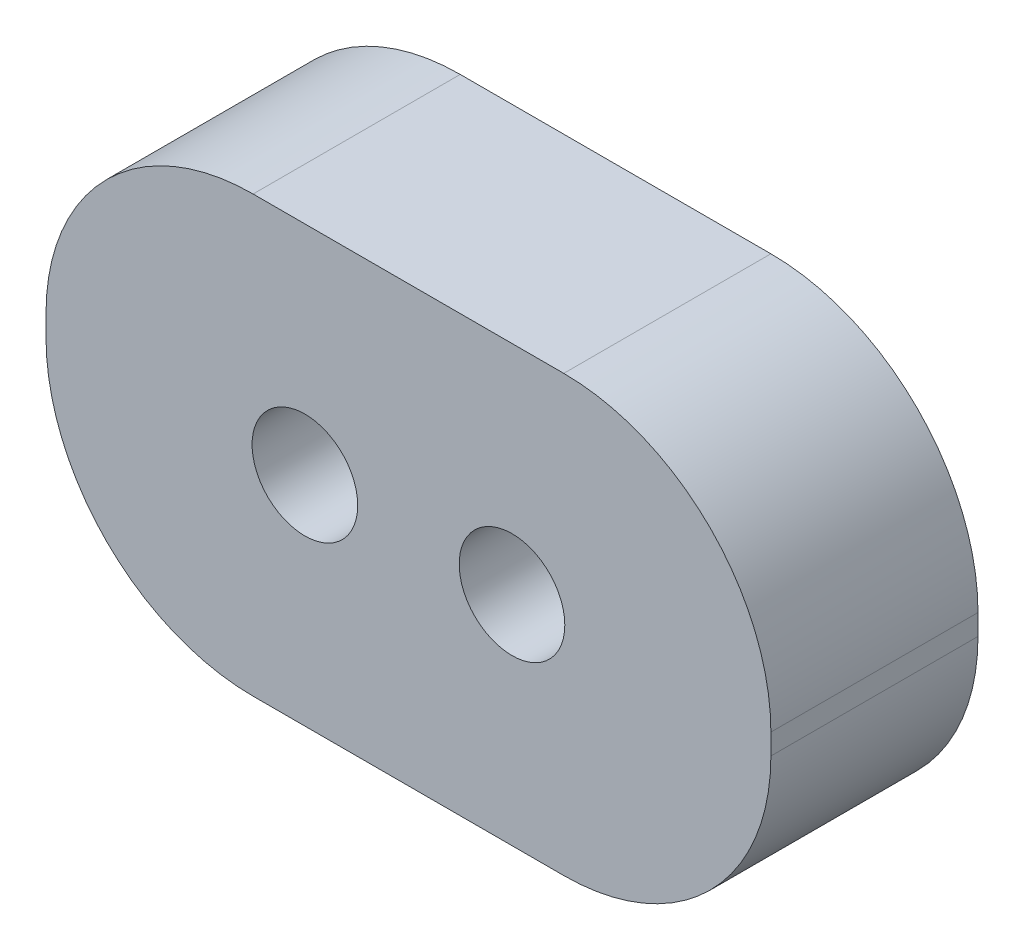
ISO-10303-21;
HEADER;
FILE_DESCRIPTION(('STEP AP214'),'2;1');
FILE_NAME('part.step','',(''),(''),'','','');
FILE_SCHEMA(('AUTOMOTIVE_DESIGN { 1 0 10303 214 1 1 1 1 }'));
ENDSEC;
DATA;
#1=APPLICATION_CONTEXT('core data for automotive mechanical design processes');
#2=APPLICATION_PROTOCOL_DEFINITION('international standard','automotive_design',2000,#1);
#3=PRODUCT_CONTEXT('',#1,'mechanical');
#4=PRODUCT('Part','Part','',(#3));
#5=PRODUCT_RELATED_PRODUCT_CATEGORY('part','',(#4));
#6=PRODUCT_DEFINITION_FORMATION('','',#4);
#7=PRODUCT_DEFINITION_CONTEXT('part definition',#1,'design');
#8=PRODUCT_DEFINITION('design','',#6,#7);
#9=PRODUCT_DEFINITION_SHAPE('','',#8);
#10=(LENGTH_UNIT() NAMED_UNIT(*) SI_UNIT(.MILLI.,.METRE.));
#11=(NAMED_UNIT(*) PLANE_ANGLE_UNIT() SI_UNIT($,.RADIAN.));
#12=(NAMED_UNIT(*) SI_UNIT($,.STERADIAN.) SOLID_ANGLE_UNIT());
#13=UNCERTAINTY_MEASURE_WITH_UNIT(LENGTH_MEASURE(1.E-05),#10,'distance_accuracy_value','');
#14=(GEOMETRIC_REPRESENTATION_CONTEXT(3) GLOBAL_UNCERTAINTY_ASSIGNED_CONTEXT((#13)) GLOBAL_UNIT_ASSIGNED_CONTEXT((#10,
#11,#12)) REPRESENTATION_CONTEXT('',''));
#15=CARTESIAN_POINT('',(0.,0.,0.));
#16=DIRECTION('',(0.,0.,1.));
#17=DIRECTION('',(1.,0.,0.));
#18=AXIS2_PLACEMENT_3D('',#15,#16,#17);
#19=CARTESIAN_POINT('',(-158.522817540017,297.237393461444,10.));
#20=DIRECTION('',(0.,0.,1.));
#21=DIRECTION('',(1.,0.,0.));
#22=AXIS2_PLACEMENT_3D('',#19,#20,#21);
#23=PLANE('',#22);
#24=CARTESIAN_POINT('',(-171.022817540019,296.73739346264,10.));
#25=DIRECTION('',(0.,0.,1.));
#26=DIRECTION('',(1.,0.,0.));
#27=AXIS2_PLACEMENT_3D('',#24,#25,#26);
#28=CIRCLE('',#27,2.55);
#29=CARTESIAN_POINT('',(-168.472817540019,296.73739346264,10.));
#30=VERTEX_POINT('',#29);
#31=EDGE_CURVE('E135',#30,#30,#28,.T.);
#32=ORIENTED_EDGE('',*,*,#31,.F.);
#33=EDGE_LOOP('',(#32));
#34=FACE_BOUND('',#33,.T.);
#35=CARTESIAN_POINT('',(-158.522817540017,297.237393461444,10.));
#36=DIRECTION('',(0.,0.,1.));
#37=DIRECTION('',(1.,0.,0.));
#38=AXIS2_PLACEMENT_3D('',#35,#36,#37);
#39=CIRCLE('',#38,9.99999999999902);
#40=CARTESIAN_POINT('',(-148.522817540018,297.237393461444,10.));
#41=VERTEX_POINT('',#40);
#42=CARTESIAN_POINT('',(-158.522817540018,307.237393461443,10.));
#43=VERTEX_POINT('',#42);
#44=EDGE_CURVE('E146',#41,#43,#39,.T.);
#45=ORIENTED_EDGE('',*,*,#44,.T.);
#46=DIRECTION('',(-1.,0.,0.));
#47=VECTOR('',#46,1.);
#48=CARTESIAN_POINT('',(-158.522817540018,307.237393461443,10.));
#49=LINE('',#48,#47);
#50=CARTESIAN_POINT('',(-173.522817540019,307.237393461443,10.));
#51=VERTEX_POINT('',#50);
#52=EDGE_CURVE('E94',#43,#51,#49,.T.);
#53=ORIENTED_EDGE('',*,*,#52,.T.);
#54=CARTESIAN_POINT('',(-173.52281754002,297.237393461444,10.));
#55=DIRECTION('',(0.,0.,1.));
#56=DIRECTION('',(1.,0.,0.));
#57=AXIS2_PLACEMENT_3D('',#54,#55,#56);
#58=CIRCLE('',#57,9.99999999999902);
#59=CARTESIAN_POINT('',(-183.522817540019,297.237393461444,10.));
#60=VERTEX_POINT('',#59);
#61=EDGE_CURVE('E161',#51,#60,#58,.T.);
#62=ORIENTED_EDGE('',*,*,#61,.T.);
#63=DIRECTION('',(0.,-1.,0.));
#64=VECTOR('',#63,1.);
#65=CARTESIAN_POINT('',(-183.522817540019,297.237393461444,10.));
#66=LINE('',#65,#64);
#67=CARTESIAN_POINT('',(-183.522817540019,296.237393463835,10.));
#68=VERTEX_POINT('',#67);
#69=EDGE_CURVE('E174',#60,#68,#66,.T.);
#70=ORIENTED_EDGE('',*,*,#69,.T.);
#71=CARTESIAN_POINT('',(-173.52281754002,296.237393463835,10.));
#72=DIRECTION('',(0.,0.,1.));
#73=DIRECTION('',(-1.,0.,0.));
#74=AXIS2_PLACEMENT_3D('',#71,#72,#73);
#75=CIRCLE('',#74,9.99999999999902);
#76=CARTESIAN_POINT('',(-173.522817540019,286.237393463836,10.));
#77=VERTEX_POINT('',#76);
#78=EDGE_CURVE('E113',#68,#77,#75,.T.);
#79=ORIENTED_EDGE('',*,*,#78,.T.);
#80=DIRECTION('',(1.,0.,0.));
#81=VECTOR('',#80,1.);
#82=CARTESIAN_POINT('',(-158.522817540018,286.237393463836,10.));
#83=LINE('',#82,#81);
#84=CARTESIAN_POINT('',(-158.522817540018,286.237393463836,10.));
#85=VERTEX_POINT('',#84);
#86=EDGE_CURVE('E107',#77,#85,#83,.T.);
#87=ORIENTED_EDGE('',*,*,#86,.T.);
#88=CARTESIAN_POINT('',(-158.522817540017,296.237393463835,10.));
#89=DIRECTION('',(0.,0.,1.));
#90=DIRECTION('',(-1.,0.,0.));
#91=AXIS2_PLACEMENT_3D('',#88,#89,#90);
#92=CIRCLE('',#91,9.99999999999902);
#93=CARTESIAN_POINT('',(-148.522817540018,296.237393463835,10.));
#94=VERTEX_POINT('',#93);
#95=EDGE_CURVE('E111',#85,#94,#92,.T.);
#96=ORIENTED_EDGE('',*,*,#95,.T.);
#97=DIRECTION('',(0.,1.,0.));
#98=VECTOR('',#97,1.);
#99=CARTESIAN_POINT('',(-148.522817540018,296.237393463835,10.));
#100=LINE('',#99,#98);
#101=EDGE_CURVE('E51',#94,#41,#100,.T.);
#102=ORIENTED_EDGE('',*,*,#101,.T.);
#103=EDGE_LOOP('',(#45,#53,#62,#70,#79,#87,#96,#102));
#104=FACE_BOUND('',#103,.T.);
#105=CARTESIAN_POINT('',(-161.022817540019,296.73739346264,10.));
#106=DIRECTION('',(0.,0.,1.));
#107=DIRECTION('',(1.,0.,0.));
#108=AXIS2_PLACEMENT_3D('',#105,#106,#107);
#109=CIRCLE('',#108,2.55);
#110=CARTESIAN_POINT('',(-158.472817540019,296.73739346264,10.));
#111=VERTEX_POINT('',#110);
#112=EDGE_CURVE('E183',#111,#111,#109,.T.);
#113=ORIENTED_EDGE('',*,*,#112,.F.);
#114=EDGE_LOOP('',(#113));
#115=FACE_BOUND('',#114,.T.);
#116=ADVANCED_FACE('F34',(#34,#104,#115),#23,.T.);
#117=CARTESIAN_POINT('',(-158.522817540017,297.237393461444,0.));
#118=DIRECTION('',(0.,0.,1.));
#119=DIRECTION('',(1.,0.,0.));
#120=AXIS2_PLACEMENT_3D('',#117,#118,#119);
#121=PLANE('',#120);
#122=CARTESIAN_POINT('',(-171.022817540019,296.73739346264,0.));
#123=DIRECTION('',(0.,0.,1.));
#124=DIRECTION('',(1.,0.,0.));
#125=AXIS2_PLACEMENT_3D('',#122,#123,#124);
#126=CIRCLE('',#125,2.55);
#127=CARTESIAN_POINT('',(-168.472817540019,296.73739346264,0.));
#128=VERTEX_POINT('',#127);
#129=EDGE_CURVE('E180',#128,#128,#126,.T.);
#130=ORIENTED_EDGE('',*,*,#129,.T.);
#131=EDGE_LOOP('',(#130));
#132=FACE_BOUND('',#131,.T.);
#133=CARTESIAN_POINT('',(-158.522817540017,297.237393461444,0.));
#134=DIRECTION('',(0.,0.,1.));
#135=DIRECTION('',(1.,0.,0.));
#136=AXIS2_PLACEMENT_3D('',#133,#134,#135);
#137=CIRCLE('',#136,9.99999999999902);
#138=CARTESIAN_POINT('',(-148.522817540018,297.237393461444,0.));
#139=VERTEX_POINT('',#138);
#140=CARTESIAN_POINT('',(-158.522817540018,307.237393461443,0.));
#141=VERTEX_POINT('',#140);
#142=EDGE_CURVE('E131',#139,#141,#137,.T.);
#143=ORIENTED_EDGE('',*,*,#142,.F.);
#144=DIRECTION('',(0.,1.,0.));
#145=VECTOR('',#144,1.);
#146=CARTESIAN_POINT('',(-148.522817540018,296.237393463835,0.));
#147=LINE('',#146,#145);
#148=CARTESIAN_POINT('',(-148.522817540018,296.237393463835,0.));
#149=VERTEX_POINT('',#148);
#150=EDGE_CURVE('E86',#149,#139,#147,.T.);
#151=ORIENTED_EDGE('',*,*,#150,.F.);
#152=CARTESIAN_POINT('',(-158.522817540017,296.237393463835,0.));
#153=DIRECTION('',(0.,0.,1.));
#154=DIRECTION('',(-1.,0.,0.));
#155=AXIS2_PLACEMENT_3D('',#152,#153,#154);
#156=CIRCLE('',#155,9.99999999999902);
#157=CARTESIAN_POINT('',(-158.522817540018,286.237393463836,0.));
#158=VERTEX_POINT('',#157);
#159=EDGE_CURVE('E80',#158,#149,#156,.T.);
#160=ORIENTED_EDGE('',*,*,#159,.F.);
#161=DIRECTION('',(1.,0.,0.));
#162=VECTOR('',#161,1.);
#163=CARTESIAN_POINT('',(-158.522817540018,286.237393463836,0.));
#164=LINE('',#163,#162);
#165=CARTESIAN_POINT('',(-173.522817540019,286.237393463836,0.));
#166=VERTEX_POINT('',#165);
#167=EDGE_CURVE('E121',#166,#158,#164,.T.);
#168=ORIENTED_EDGE('',*,*,#167,.F.);
#169=CARTESIAN_POINT('',(-173.52281754002,296.237393463835,0.));
#170=DIRECTION('',(0.,0.,1.));
#171=DIRECTION('',(-1.,0.,0.));
#172=AXIS2_PLACEMENT_3D('',#169,#170,#171);
#173=CIRCLE('',#172,9.99999999999902);
#174=CARTESIAN_POINT('',(-183.522817540019,296.237393463835,0.));
#175=VERTEX_POINT('',#174);
#176=EDGE_CURVE('E141',#175,#166,#173,.T.);
#177=ORIENTED_EDGE('',*,*,#176,.F.);
#178=DIRECTION('',(0.,-1.,0.));
#179=VECTOR('',#178,1.);
#180=CARTESIAN_POINT('',(-183.522817540019,297.237393461444,0.));
#181=LINE('',#180,#179);
#182=CARTESIAN_POINT('',(-183.522817540019,297.237393461444,0.));
#183=VERTEX_POINT('',#182);
#184=EDGE_CURVE('E139',#183,#175,#181,.T.);
#185=ORIENTED_EDGE('',*,*,#184,.F.);
#186=CARTESIAN_POINT('',(-173.52281754002,297.237393461444,0.));
#187=DIRECTION('',(0.,0.,1.));
#188=DIRECTION('',(1.,0.,0.));
#189=AXIS2_PLACEMENT_3D('',#186,#187,#188);
#190=CIRCLE('',#189,9.99999999999902);
#191=CARTESIAN_POINT('',(-173.522817540019,307.237393461443,0.));
#192=VERTEX_POINT('',#191);
#193=EDGE_CURVE('E137',#192,#183,#190,.T.);
#194=ORIENTED_EDGE('',*,*,#193,.F.);
#195=DIRECTION('',(-1.,0.,0.));
#196=VECTOR('',#195,1.);
#197=CARTESIAN_POINT('',(-158.522817540018,307.237393461443,0.));
#198=LINE('',#197,#196);
#199=EDGE_CURVE('E134',#141,#192,#198,.T.);
#200=ORIENTED_EDGE('',*,*,#199,.F.);
#201=EDGE_LOOP('',(#143,#151,#160,#168,#177,#185,#194,#200));
#202=FACE_BOUND('',#201,.T.);
#203=CARTESIAN_POINT('',(-161.022817540019,296.73739346264,0.));
#204=DIRECTION('',(0.,0.,1.));
#205=DIRECTION('',(1.,0.,0.));
#206=AXIS2_PLACEMENT_3D('',#203,#204,#205);
#207=CIRCLE('',#206,2.55);
#208=CARTESIAN_POINT('',(-158.472817540019,296.73739346264,0.));
#209=VERTEX_POINT('',#208);
#210=EDGE_CURVE('E186',#209,#209,#207,.T.);
#211=ORIENTED_EDGE('',*,*,#210,.T.);
#212=EDGE_LOOP('',(#211));
#213=FACE_BOUND('',#212,.T.);
#214=ADVANCED_FACE('F165',(#132,#202,#213),#121,.F.);
#215=CARTESIAN_POINT('',(-158.522817540017,297.237393461444,10.));
#216=DIRECTION('',(0.,0.,-1.));
#217=DIRECTION('',(-1.,0.,0.));
#218=AXIS2_PLACEMENT_3D('',#215,#216,#217);
#219=CYLINDRICAL_SURFACE('',#218,9.99999999999902);
#220=ORIENTED_EDGE('',*,*,#142,.T.);
#221=DIRECTION('',(0.,0.,-1.));
#222=VECTOR('',#221,1.);
#223=CARTESIAN_POINT('',(-158.522817540018,307.237393461443,10.));
#224=LINE('',#223,#222);
#225=EDGE_CURVE('E11',#43,#141,#224,.T.);
#226=ORIENTED_EDGE('',*,*,#225,.F.);
#227=ORIENTED_EDGE('',*,*,#44,.F.);
#228=DIRECTION('',(0.,0.,-1.));
#229=VECTOR('',#228,1.);
#230=CARTESIAN_POINT('',(-148.522817540018,297.237393461444,10.));
#231=LINE('',#230,#229);
#232=EDGE_CURVE('E127',#41,#139,#231,.T.);
#233=ORIENTED_EDGE('',*,*,#232,.T.);
#234=EDGE_LOOP('',(#220,#226,#227,#233));
#235=FACE_BOUND('',#234,.T.);
#236=ADVANCED_FACE('F36',(#235),#219,.T.);
#237=CARTESIAN_POINT('',(-158.522817540018,307.237393461443,10.));
#238=DIRECTION('',(0.,-1.,0.));
#239=DIRECTION('',(0.,0.,-1.));
#240=AXIS2_PLACEMENT_3D('',#237,#238,#239);
#241=PLANE('',#240);
#242=ORIENTED_EDGE('',*,*,#199,.T.);
#243=DIRECTION('',(0.,0.,-1.));
#244=VECTOR('',#243,1.);
#245=CARTESIAN_POINT('',(-173.522817540019,307.237393461443,10.));
#246=LINE('',#245,#244);
#247=EDGE_CURVE('E43',#51,#192,#246,.T.);
#248=ORIENTED_EDGE('',*,*,#247,.F.);
#249=ORIENTED_EDGE('',*,*,#52,.F.);
#250=ORIENTED_EDGE('',*,*,#225,.T.);
#251=EDGE_LOOP('',(#242,#248,#249,#250));
#252=FACE_BOUND('',#251,.T.);
#253=ADVANCED_FACE('F219',(#252),#241,.F.);
#254=CARTESIAN_POINT('',(-173.52281754002,297.237393461444,10.));
#255=DIRECTION('',(0.,0.,-1.));
#256=DIRECTION('',(-1.,0.,0.));
#257=AXIS2_PLACEMENT_3D('',#254,#255,#256);
#258=CYLINDRICAL_SURFACE('',#257,9.99999999999902);
#259=ORIENTED_EDGE('',*,*,#193,.T.);
#260=DIRECTION('',(0.,0.,-1.));
#261=VECTOR('',#260,1.);
#262=CARTESIAN_POINT('',(-183.522817540019,297.237393461444,10.));
#263=LINE('',#262,#261);
#264=EDGE_CURVE('E153',#60,#183,#263,.T.);
#265=ORIENTED_EDGE('',*,*,#264,.F.);
#266=ORIENTED_EDGE('',*,*,#61,.F.);
#267=ORIENTED_EDGE('',*,*,#247,.T.);
#268=EDGE_LOOP('',(#259,#265,#266,#267));
#269=FACE_BOUND('',#268,.T.);
#270=ADVANCED_FACE('F159',(#269),#258,.T.);
#271=CARTESIAN_POINT('',(-183.522817540019,297.237393461444,10.));
#272=DIRECTION('',(1.,0.,0.));
#273=DIRECTION('',(0.,0.,-1.));
#274=AXIS2_PLACEMENT_3D('',#271,#272,#273);
#275=PLANE('',#274);
#276=ORIENTED_EDGE('',*,*,#184,.T.);
#277=DIRECTION('',(0.,0.,-1.));
#278=VECTOR('',#277,1.);
#279=CARTESIAN_POINT('',(-183.522817540019,296.237393463835,10.));
#280=LINE('',#279,#278);
#281=EDGE_CURVE('E150',#68,#175,#280,.T.);
#282=ORIENTED_EDGE('',*,*,#281,.F.);
#283=ORIENTED_EDGE('',*,*,#69,.F.);
#284=ORIENTED_EDGE('',*,*,#264,.T.);
#285=EDGE_LOOP('',(#276,#282,#283,#284));
#286=FACE_BOUND('',#285,.T.);
#287=ADVANCED_FACE('F170',(#286),#275,.F.);
#288=CARTESIAN_POINT('',(-173.52281754002,296.237393463835,10.));
#289=DIRECTION('',(0.,0.,-1.));
#290=DIRECTION('',(-1.,0.,0.));
#291=AXIS2_PLACEMENT_3D('',#288,#289,#290);
#292=CYLINDRICAL_SURFACE('',#291,9.99999999999902);
#293=ORIENTED_EDGE('',*,*,#176,.T.);
#294=DIRECTION('',(0.,0.,-1.));
#295=VECTOR('',#294,1.);
#296=CARTESIAN_POINT('',(-173.522817540019,286.237393463836,10.));
#297=LINE('',#296,#295);
#298=EDGE_CURVE('E122',#77,#166,#297,.T.);
#299=ORIENTED_EDGE('',*,*,#298,.F.);
#300=ORIENTED_EDGE('',*,*,#78,.F.);
#301=ORIENTED_EDGE('',*,*,#281,.T.);
#302=EDGE_LOOP('',(#293,#299,#300,#301));
#303=FACE_BOUND('',#302,.T.);
#304=ADVANCED_FACE('F173',(#303),#292,.T.);
#305=CARTESIAN_POINT('',(-158.522817540018,286.237393463836,10.));
#306=DIRECTION('',(0.,1.,0.));
#307=DIRECTION('',(0.,0.,1.));
#308=AXIS2_PLACEMENT_3D('',#305,#306,#307);
#309=PLANE('',#308);
#310=ORIENTED_EDGE('',*,*,#167,.T.);
#311=DIRECTION('',(0.,0.,-1.));
#312=VECTOR('',#311,1.);
#313=CARTESIAN_POINT('',(-158.522817540018,286.237393463836,10.));
#314=LINE('',#313,#312);
#315=EDGE_CURVE('E118',#85,#158,#314,.T.);
#316=ORIENTED_EDGE('',*,*,#315,.F.);
#317=ORIENTED_EDGE('',*,*,#86,.F.);
#318=ORIENTED_EDGE('',*,*,#298,.T.);
#319=EDGE_LOOP('',(#310,#316,#317,#318));
#320=FACE_BOUND('',#319,.T.);
#321=ADVANCED_FACE('F119',(#320),#309,.F.);
#322=CARTESIAN_POINT('',(-158.522817540017,296.237393463835,10.));
#323=DIRECTION('',(0.,0.,-1.));
#324=DIRECTION('',(-1.,0.,0.));
#325=AXIS2_PLACEMENT_3D('',#322,#323,#324);
#326=CYLINDRICAL_SURFACE('',#325,9.99999999999902);
#327=ORIENTED_EDGE('',*,*,#159,.T.);
#328=DIRECTION('',(0.,0.,-1.));
#329=VECTOR('',#328,1.);
#330=CARTESIAN_POINT('',(-148.522817540018,296.237393463835,10.));
#331=LINE('',#330,#329);
#332=EDGE_CURVE('E123',#94,#149,#331,.T.);
#333=ORIENTED_EDGE('',*,*,#332,.F.);
#334=ORIENTED_EDGE('',*,*,#95,.F.);
#335=ORIENTED_EDGE('',*,*,#315,.T.);
#336=EDGE_LOOP('',(#327,#333,#334,#335));
#337=FACE_BOUND('',#336,.T.);
#338=ADVANCED_FACE('F125',(#337),#326,.T.);
#339=CARTESIAN_POINT('',(-148.522817540018,296.237393463835,10.));
#340=DIRECTION('',(-1.,0.,0.));
#341=DIRECTION('',(0.,0.,1.));
#342=AXIS2_PLACEMENT_3D('',#339,#340,#341);
#343=PLANE('',#342);
#344=ORIENTED_EDGE('',*,*,#150,.T.);
#345=ORIENTED_EDGE('',*,*,#232,.F.);
#346=ORIENTED_EDGE('',*,*,#101,.F.);
#347=ORIENTED_EDGE('',*,*,#332,.T.);
#348=EDGE_LOOP('',(#344,#345,#346,#347));
#349=FACE_BOUND('',#348,.T.);
#350=ADVANCED_FACE('F207',(#349),#343,.F.);
#351=CARTESIAN_POINT('',(-171.022817540019,296.73739346264,10.));
#352=DIRECTION('',(0.,0.,-1.));
#353=DIRECTION('',(-1.,0.,0.));
#354=AXIS2_PLACEMENT_3D('',#351,#352,#353);
#355=CYLINDRICAL_SURFACE('',#354,2.55);
#356=ORIENTED_EDGE('',*,*,#31,.T.);
#357=EDGE_LOOP('',(#356));
#358=FACE_BOUND('',#357,.T.);
#359=ORIENTED_EDGE('',*,*,#129,.F.);
#360=EDGE_LOOP('',(#359));
#361=FACE_BOUND('',#360,.T.);
#362=ADVANCED_FACE('F204',(#358,#361),#355,.F.);
#363=CARTESIAN_POINT('',(-161.022817540019,296.73739346264,10.));
#364=DIRECTION('',(0.,0.,-1.));
#365=DIRECTION('',(-1.,0.,0.));
#366=AXIS2_PLACEMENT_3D('',#363,#364,#365);
#367=CYLINDRICAL_SURFACE('',#366,2.55);
#368=ORIENTED_EDGE('',*,*,#112,.T.);
#369=EDGE_LOOP('',(#368));
#370=FACE_BOUND('',#369,.T.);
#371=ORIENTED_EDGE('',*,*,#210,.F.);
#372=EDGE_LOOP('',(#371));
#373=FACE_BOUND('',#372,.T.);
#374=ADVANCED_FACE('F192',(#370,#373),#367,.F.);
#375=CLOSED_SHELL('',(#116,#214,#236,#253,#270,#287,#304,#321,#338,#350,#362,#374));
#376=MANIFOLD_SOLID_BREP('B2',#375);
#377=ADVANCED_BREP_SHAPE_REPRESENTATION('',(#18,#376),#14);
#378=SHAPE_DEFINITION_REPRESENTATION(#9,#377);
ENDSEC;
END-ISO-10303-21;
